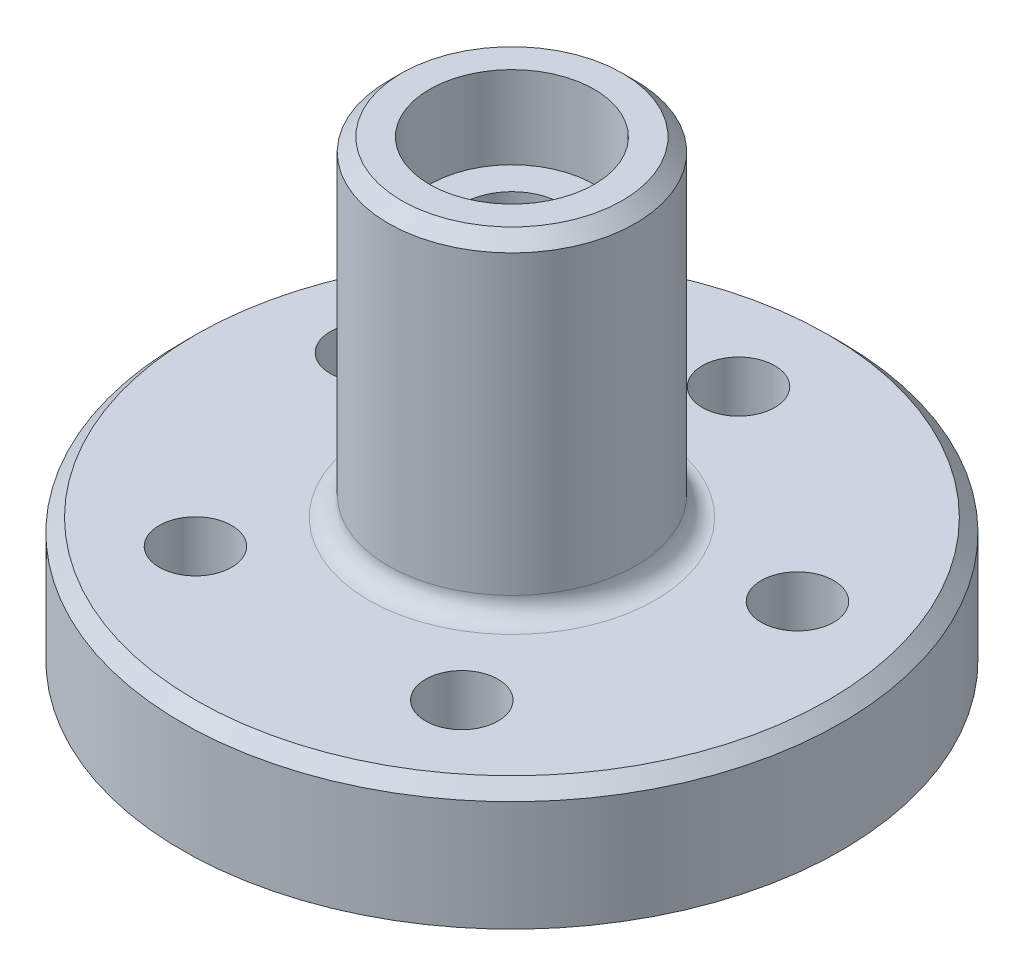
ISO-10303-21;
HEADER;
FILE_DESCRIPTION(('STEP AP214'),'2;1');
FILE_NAME('part.step','',(''),(''),'','','');
FILE_SCHEMA(('AUTOMOTIVE_DESIGN { 1 0 10303 214 1 1 1 1 }'));
ENDSEC;
DATA;
#1=APPLICATION_CONTEXT('core data for automotive mechanical design processes');
#2=APPLICATION_PROTOCOL_DEFINITION('international standard','automotive_design',2000,#1);
#3=PRODUCT_CONTEXT('',#1,'mechanical');
#4=PRODUCT('Part','Part','',(#3));
#5=PRODUCT_RELATED_PRODUCT_CATEGORY('part','',(#4));
#6=PRODUCT_DEFINITION_FORMATION('','',#4);
#7=PRODUCT_DEFINITION_CONTEXT('part definition',#1,'design');
#8=PRODUCT_DEFINITION('design','',#6,#7);
#9=PRODUCT_DEFINITION_SHAPE('','',#8);
#10=(LENGTH_UNIT() NAMED_UNIT(*) SI_UNIT(.MILLI.,.METRE.));
#11=(NAMED_UNIT(*) PLANE_ANGLE_UNIT() SI_UNIT($,.RADIAN.));
#12=(NAMED_UNIT(*) SI_UNIT($,.STERADIAN.) SOLID_ANGLE_UNIT());
#13=UNCERTAINTY_MEASURE_WITH_UNIT(LENGTH_MEASURE(1.E-05),#10,'distance_accuracy_value','');
#14=(GEOMETRIC_REPRESENTATION_CONTEXT(3) GLOBAL_UNCERTAINTY_ASSIGNED_CONTEXT((#13)) GLOBAL_UNIT_ASSIGNED_CONTEXT((#10,
#11,#12)) REPRESENTATION_CONTEXT('',''));
#15=CARTESIAN_POINT('',(0.,0.,0.));
#16=DIRECTION('',(0.,0.,1.));
#17=DIRECTION('',(1.,0.,0.));
#18=AXIS2_PLACEMENT_3D('',#15,#16,#17);
#19=CARTESIAN_POINT('',(0.,19.05,0.));
#20=DIRECTION('',(0.,-1.,0.));
#21=DIRECTION('',(0.,0.,-1.));
#22=AXIS2_PLACEMENT_3D('',#19,#20,#21);
#23=CYLINDRICAL_SURFACE('',#22,50.8);
#24=CARTESIAN_POINT('',(0.,17.0180000000001,0.));
#25=DIRECTION('',(0.,1.,0.));
#26=DIRECTION('',(0.,0.,1.));
#27=AXIS2_PLACEMENT_3D('',#24,#25,#26);
#28=CIRCLE('',#27,50.8);
#29=CARTESIAN_POINT('',(0.,17.0180000000001,-50.8));
#30=VERTEX_POINT('',#29);
#31=EDGE_CURVE('E64',#30,#30,#28,.F.);
#32=CARTESIAN_POINT('',(0.,0.,0.));
#33=DIRECTION('',(0.,1.,0.));
#34=DIRECTION('',(0.,0.,1.));
#35=AXIS2_PLACEMENT_3D('',#32,#33,#34);
#36=CIRCLE('',#35,50.8);
#37=CARTESIAN_POINT('',(0.,0.,-50.8));
#38=VERTEX_POINT('',#37);
#39=EDGE_CURVE('E72',#38,#38,#36,.T.);
#40=CARTESIAN_POINT('',(0.,17.0180000000001,-50.8));
#41=CARTESIAN_POINT('',(0.,16.8407291666668,-50.8));
#42=CARTESIAN_POINT('',(0.,16.6634583333334,-50.8));
#43=CARTESIAN_POINT('',(0.,16.3089166666668,-50.8));
#44=CARTESIAN_POINT('',(0.,16.1316458333334,-50.8));
#45=CARTESIAN_POINT('',(0.,15.7771041666668,-50.8));
#46=CARTESIAN_POINT('',(0.,15.5998333333334,-50.8));
#47=CARTESIAN_POINT('',(0.,15.2452916666668,-50.8));
#48=CARTESIAN_POINT('',(0.,15.0680208333334,-50.8));
#49=CARTESIAN_POINT('',(0.,14.7134791666668,-50.8));
#50=CARTESIAN_POINT('',(0.,14.5362083333334,-50.8));
#51=CARTESIAN_POINT('',(0.,14.1816666666668,-50.8));
#52=CARTESIAN_POINT('',(0.,14.0043958333334,-50.8));
#53=CARTESIAN_POINT('',(0.,13.6498541666668,-50.8));
#54=CARTESIAN_POINT('',(0.,13.4725833333334,-50.8));
#55=CARTESIAN_POINT('',(0.,13.1180416666667,-50.8));
#56=CARTESIAN_POINT('',(0.,12.9407708333334,-50.8));
#57=CARTESIAN_POINT('',(0.,12.5862291666667,-50.8));
#58=CARTESIAN_POINT('',(0.,12.4089583333334,-50.8));
#59=CARTESIAN_POINT('',(0.,12.0544166666667,-50.8));
#60=CARTESIAN_POINT('',(0.,11.8771458333334,-50.8));
#61=CARTESIAN_POINT('',(0.,11.5226041666667,-50.8));
#62=CARTESIAN_POINT('',(0.,11.3453333333334,-50.8));
#63=CARTESIAN_POINT('',(0.,10.9907916666667,-50.8));
#64=CARTESIAN_POINT('',(0.,10.8135208333334,-50.8));
#65=CARTESIAN_POINT('',(0.,10.4589791666667,-50.8));
#66=CARTESIAN_POINT('',(0.,10.2817083333334,-50.8));
#67=CARTESIAN_POINT('',(0.,9.92716666666673,-50.8));
#68=CARTESIAN_POINT('',(0.,9.74989583333339,-50.8));
#69=CARTESIAN_POINT('',(0.,9.39535416666672,-50.8));
#70=CARTESIAN_POINT('',(0.,9.21808333333339,-50.8));
#71=CARTESIAN_POINT('',(0.,8.86354166666672,-50.8));
#72=CARTESIAN_POINT('',(0.,8.68627083333339,-50.8));
#73=CARTESIAN_POINT('',(0.,8.33172916666672,-50.8));
#74=CARTESIAN_POINT('',(0.,8.15445833333338,-50.8));
#75=CARTESIAN_POINT('',(0.,7.79991666666671,-50.8));
#76=CARTESIAN_POINT('',(0.,7.62264583333338,-50.8));
#77=CARTESIAN_POINT('',(0.,7.26810416666671,-50.8));
#78=CARTESIAN_POINT('',(0.,7.09083333333338,-50.8));
#79=CARTESIAN_POINT('',(0.,6.73629166666671,-50.8));
#80=CARTESIAN_POINT('',(0.,6.55902083333337,-50.8));
#81=CARTESIAN_POINT('',(0.,6.2044791666667,-50.8));
#82=CARTESIAN_POINT('',(0.,6.02720833333337,-50.8));
#83=CARTESIAN_POINT('',(0.,5.6726666666667,-50.8));
#84=CARTESIAN_POINT('',(0.,5.49539583333337,-50.8));
#85=CARTESIAN_POINT('',(0.,5.1408541666667,-50.8));
#86=CARTESIAN_POINT('',(0.,4.96358333333336,-50.8));
#87=CARTESIAN_POINT('',(0.,4.60904166666669,-50.8));
#88=CARTESIAN_POINT('',(0.,4.43177083333336,-50.8));
#89=CARTESIAN_POINT('',(0.,4.07722916666669,-50.8));
#90=CARTESIAN_POINT('',(0.,3.89995833333336,-50.8));
#91=CARTESIAN_POINT('',(0.,3.54541666666669,-50.8));
#92=CARTESIAN_POINT('',(0.,3.36814583333335,-50.8));
#93=CARTESIAN_POINT('',(0.,3.01360416666668,-50.8));
#94=CARTESIAN_POINT('',(0.,2.83633333333335,-50.8));
#95=CARTESIAN_POINT('',(0.,2.48179166666668,-50.8));
#96=CARTESIAN_POINT('',(0.,2.30452083333335,-50.8));
#97=CARTESIAN_POINT('',(0.,1.94997916666668,-50.8));
#98=CARTESIAN_POINT('',(0.,1.77270833333334,-50.8));
#99=CARTESIAN_POINT('',(0.,1.41816666666667,-50.8));
#100=CARTESIAN_POINT('',(0.,1.24089583333334,-50.8));
#101=CARTESIAN_POINT('',(0.,0.88635416666667,-50.8));
#102=CARTESIAN_POINT('',(0.,0.709083333333335,-50.8));
#103=CARTESIAN_POINT('',(0.,0.354541666666666,-50.8));
#104=CARTESIAN_POINT('',(0.,0.177270833333333,-50.8));
#105=CARTESIAN_POINT('',(0.,0.,-50.8));
#106=B_SPLINE_CURVE_WITH_KNOTS('',3,(#40,#41,#42,#43,#44,#45,#46,#47,#48,#49,#50,#51,#52,#53,
#54,#55,#56,#57,#58,#59,#60,#61,#62,#63,#64,#65,#66,#67,#68,#69,#70,#71,#72,#73,#74,#75,#76,#77,
#78,#79,#80,#81,#82,#83,#84,#85,#86,#87,#88,#89,#90,#91,#92,#93,#94,#95,#96,#97,#98,#99,#100,
#101,#102,#103,#104,#105),.UNSPECIFIED.,.F.,.F.,(4,2,2,2,2,2,2,2,2,2,2,2,2,2,2,2,2,2,2,2,2,2,2,
2,2,2,2,2,2,2,2,2,4),(0.,0.531812500000006,1.06362500000001,1.59543750000001,2.12725000000001,
2.65906250000002,3.19087500000002,3.72268750000002,4.25450000000003,4.78631250000003,
5.31812500000003,5.84993750000004,6.38175000000004,6.91356250000004,7.44537500000005,
7.97718750000005,8.50900000000006,9.04081250000006,9.57262500000006,10.1044375000001,
10.6362500000001,11.1680625000001,11.6998750000001,12.2316875000001,12.7635000000001,
13.2953125000001,13.8271250000001,14.3589375000001,14.8907500000001,15.4225625000001,
15.9543750000001,16.4861875000001,17.0180000000001),.UNSPECIFIED.);
#107=EDGE_CURVE('BSEAM39',#30,#38,#106,.T.);
#108=ORIENTED_EDGE('',*,*,#31,.T.);
#109=ORIENTED_EDGE('',*,*,#39,.T.);
#110=ORIENTED_EDGE('',*,*,#107,.T.);
#111=ORIENTED_EDGE('',*,*,#107,.F.);
#112=EDGE_LOOP('',(#108,#110,#109,#111));
#113=FACE_BOUND('',#112,.T.);
#114=ADVANCED_FACE('F39',(#113),#23,.T.);
#115=CARTESIAN_POINT('',(0.,19.05,0.));
#116=DIRECTION('',(0.,1.,0.));
#117=DIRECTION('',(0.,0.,1.));
#118=AXIS2_PLACEMENT_3D('',#115,#116,#117);
#119=PLANE('',#118);
#120=CARTESIAN_POINT('',(0.,19.05,0.));
#121=DIRECTION('',(0.,1.,0.));
#122=DIRECTION('',(0.,0.,1.));
#123=AXIS2_PLACEMENT_3D('',#120,#121,#122);
#124=CIRCLE('',#123,22.098);
#125=CARTESIAN_POINT('',(0.,19.05,22.098));
#126=VERTEX_POINT('',#125);
#127=EDGE_CURVE('E53',#126,#126,#124,.F.);
#128=ORIENTED_EDGE('',*,*,#127,.T.);
#129=EDGE_LOOP('',(#128));
#130=FACE_BOUND('',#129,.T.);
#131=CARTESIAN_POINT('',(0.,19.05,-34.925));
#132=DIRECTION('',(0.,1.,0.));
#133=DIRECTION('',(0.,0.,1.));
#134=AXIS2_PLACEMENT_3D('',#131,#132,#133);
#135=CIRCLE('',#134,5.588);
#136=CARTESIAN_POINT('',(0.,19.05,-29.337));
#137=VERTEX_POINT('',#136);
#138=EDGE_CURVE('E110',#137,#137,#135,.T.);
#139=ORIENTED_EDGE('',*,*,#138,.F.);
#140=EDGE_LOOP('',(#139));
#141=FACE_BOUND('',#140,.T.);
#142=CARTESIAN_POINT('',(33.2156488316083,19.05,-10.7924185285449));
#143=DIRECTION('',(0.,1.,0.));
#144=DIRECTION('',(0.,0.,1.));
#145=AXIS2_PLACEMENT_3D('',#142,#143,#144);
#146=CIRCLE('',#145,5.588);
#147=CARTESIAN_POINT('',(33.2156488316083,19.05,-5.20441852854495));
#148=VERTEX_POINT('',#147);
#149=EDGE_CURVE('E102',#148,#148,#146,.T.);
#150=ORIENTED_EDGE('',*,*,#149,.F.);
#151=EDGE_LOOP('',(#150));
#152=FACE_BOUND('',#151,.T.);
#153=CARTESIAN_POINT('',(20.5283999363145,19.05,28.2549185285452));
#154=DIRECTION('',(0.,1.,0.));
#155=DIRECTION('',(0.,0.,1.));
#156=AXIS2_PLACEMENT_3D('',#153,#154,#155);
#157=CIRCLE('',#156,5.588);
#158=CARTESIAN_POINT('',(20.5283999363145,19.05,33.8429185285452));
#159=VERTEX_POINT('',#158);
#160=EDGE_CURVE('E94',#159,#159,#157,.T.);
#161=ORIENTED_EDGE('',*,*,#160,.F.);
#162=EDGE_LOOP('',(#161));
#163=FACE_BOUND('',#162,.T.);
#164=CARTESIAN_POINT('',(-20.5283999363149,19.05,28.2549185285449));
#165=DIRECTION('',(0.,1.,0.));
#166=DIRECTION('',(0.,0.,1.));
#167=AXIS2_PLACEMENT_3D('',#164,#165,#166);
#168=CIRCLE('',#167,5.588);
#169=CARTESIAN_POINT('',(-20.5283999363149,19.05,33.8429185285449));
#170=VERTEX_POINT('',#169);
#171=EDGE_CURVE('E86',#170,#170,#168,.T.);
#172=ORIENTED_EDGE('',*,*,#171,.F.);
#173=EDGE_LOOP('',(#172));
#174=FACE_BOUND('',#173,.T.);
#175=CARTESIAN_POINT('',(-33.2156488316081,19.05,-10.7924185285454));
#176=DIRECTION('',(0.,1.,0.));
#177=DIRECTION('',(0.,0.,1.));
#178=AXIS2_PLACEMENT_3D('',#175,#176,#177);
#179=CIRCLE('',#178,5.588);
#180=CARTESIAN_POINT('',(-33.2156488316081,19.05,-5.20441852854542));
#181=VERTEX_POINT('',#180);
#182=EDGE_CURVE('E77',#181,#181,#179,.T.);
#183=ORIENTED_EDGE('',*,*,#182,.F.);
#184=EDGE_LOOP('',(#183));
#185=FACE_BOUND('',#184,.T.);
#186=CARTESIAN_POINT('',(0.,19.05,0.));
#187=DIRECTION('',(0.,1.,0.));
#188=DIRECTION('',(0.,0.,1.));
#189=AXIS2_PLACEMENT_3D('',#186,#187,#188);
#190=CIRCLE('',#189,48.7680000000001);
#191=CARTESIAN_POINT('',(0.,19.05,48.7680000000001));
#192=VERTEX_POINT('',#191);
#193=EDGE_CURVE('E68',#192,#192,#190,.T.);
#194=ORIENTED_EDGE('',*,*,#193,.T.);
#195=EDGE_LOOP('',(#194));
#196=FACE_BOUND('',#195,.T.);
#197=ADVANCED_FACE('F167',(#130,#141,#152,#163,#174,#185,#196),#119,.T.);
#198=CARTESIAN_POINT('',(0.,0.,0.));
#199=DIRECTION('',(0.,1.,0.));
#200=DIRECTION('',(0.,0.,1.));
#201=AXIS2_PLACEMENT_3D('',#198,#199,#200);
#202=PLANE('',#201);
#203=CARTESIAN_POINT('',(0.,0.,0.));
#204=DIRECTION('',(0.,1.,0.));
#205=DIRECTION('',(0.,0.,1.));
#206=AXIS2_PLACEMENT_3D('',#203,#204,#205);
#207=CIRCLE('',#206,7.62);
#208=CARTESIAN_POINT('',(0.,0.,7.62));
#209=VERTEX_POINT('',#208);
#210=EDGE_CURVE('E121',#209,#209,#207,.T.);
#211=ORIENTED_EDGE('',*,*,#210,.T.);
#212=EDGE_LOOP('',(#211));
#213=FACE_BOUND('',#212,.T.);
#214=CARTESIAN_POINT('',(0.,0.,-34.925));
#215=DIRECTION('',(0.,1.,0.));
#216=DIRECTION('',(0.,0.,1.));
#217=AXIS2_PLACEMENT_3D('',#214,#215,#216);
#218=CIRCLE('',#217,5.588);
#219=CARTESIAN_POINT('',(0.,0.,-29.337));
#220=VERTEX_POINT('',#219);
#221=EDGE_CURVE('E76',#220,#220,#218,.T.);
#222=ORIENTED_EDGE('',*,*,#221,.T.);
#223=EDGE_LOOP('',(#222));
#224=FACE_BOUND('',#223,.T.);
#225=CARTESIAN_POINT('',(33.2156488316083,0.,-10.7924185285449));
#226=DIRECTION('',(0.,1.,0.));
#227=DIRECTION('',(0.,0.,1.));
#228=AXIS2_PLACEMENT_3D('',#225,#226,#227);
#229=CIRCLE('',#228,5.588);
#230=CARTESIAN_POINT('',(33.2156488316083,0.,-5.20441852854495));
#231=VERTEX_POINT('',#230);
#232=EDGE_CURVE('E106',#231,#231,#229,.T.);
#233=ORIENTED_EDGE('',*,*,#232,.T.);
#234=EDGE_LOOP('',(#233));
#235=FACE_BOUND('',#234,.T.);
#236=CARTESIAN_POINT('',(20.5283999363145,0.,28.2549185285452));
#237=DIRECTION('',(0.,1.,0.));
#238=DIRECTION('',(0.,0.,1.));
#239=AXIS2_PLACEMENT_3D('',#236,#237,#238);
#240=CIRCLE('',#239,5.588);
#241=CARTESIAN_POINT('',(20.5283999363145,0.,33.8429185285452));
#242=VERTEX_POINT('',#241);
#243=EDGE_CURVE('E98',#242,#242,#240,.T.);
#244=ORIENTED_EDGE('',*,*,#243,.T.);
#245=EDGE_LOOP('',(#244));
#246=FACE_BOUND('',#245,.T.);
#247=CARTESIAN_POINT('',(-20.5283999363149,0.,28.2549185285449));
#248=DIRECTION('',(0.,1.,0.));
#249=DIRECTION('',(0.,0.,1.));
#250=AXIS2_PLACEMENT_3D('',#247,#248,#249);
#251=CIRCLE('',#250,5.588);
#252=CARTESIAN_POINT('',(-20.5283999363149,0.,33.8429185285449));
#253=VERTEX_POINT('',#252);
#254=EDGE_CURVE('E90',#253,#253,#251,.T.);
#255=ORIENTED_EDGE('',*,*,#254,.T.);
#256=EDGE_LOOP('',(#255));
#257=FACE_BOUND('',#256,.T.);
#258=CARTESIAN_POINT('',(-33.2156488316081,0.,-10.7924185285454));
#259=DIRECTION('',(0.,1.,0.));
#260=DIRECTION('',(0.,0.,1.));
#261=AXIS2_PLACEMENT_3D('',#258,#259,#260);
#262=CIRCLE('',#261,5.588);
#263=CARTESIAN_POINT('',(-33.2156488316081,0.,-5.20441852854542));
#264=VERTEX_POINT('',#263);
#265=EDGE_CURVE('E81',#264,#264,#262,.T.);
#266=ORIENTED_EDGE('',*,*,#265,.T.);
#267=EDGE_LOOP('',(#266));
#268=FACE_BOUND('',#267,.T.);
#269=ORIENTED_EDGE('',*,*,#39,.F.);
#270=EDGE_LOOP('',(#269));
#271=FACE_BOUND('',#270,.T.);
#272=ADVANCED_FACE('F133',(#213,#224,#235,#246,#257,#268,#271),#202,.F.);
#273=CARTESIAN_POINT('',(0.,19.05,0.));
#274=DIRECTION('',(0.,-1.,0.));
#275=DIRECTION('',(0.,0.,-1.));
#276=AXIS2_PLACEMENT_3D('',#273,#274,#275);
#277=CONICAL_SURFACE('',#276,48.7680000000001,0.785398163397453);
#278=ORIENTED_EDGE('',*,*,#31,.F.);
#279=EDGE_LOOP('',(#278));
#280=FACE_BOUND('',#279,.T.);
#281=ORIENTED_EDGE('',*,*,#193,.F.);
#282=EDGE_LOOP('',(#281));
#283=FACE_BOUND('',#282,.T.);
#284=ADVANCED_FACE('F179',(#280,#283),#277,.T.);
#285=CARTESIAN_POINT('',(-33.2156488316081,0.,-10.7924185285454));
#286=DIRECTION('',(0.,1.,0.));
#287=DIRECTION('',(0.,0.,1.));
#288=AXIS2_PLACEMENT_3D('',#285,#286,#287);
#289=CYLINDRICAL_SURFACE('',#288,5.588);
#290=CARTESIAN_POINT('',(-33.2156488316081,0.,-5.20441852854542));
#291=CARTESIAN_POINT('',(-33.2156488316081,0.1984375,-5.20441852854542));
#292=CARTESIAN_POINT('',(-33.2156488316081,0.396875,-5.20441852854542));
#293=CARTESIAN_POINT('',(-33.2156488316081,0.79375,-5.20441852854542));
#294=CARTESIAN_POINT('',(-33.2156488316081,0.9921875,-5.20441852854542));
#295=CARTESIAN_POINT('',(-33.2156488316081,1.3890625,-5.20441852854542));
#296=CARTESIAN_POINT('',(-33.2156488316081,1.5875,-5.20441852854542));
#297=CARTESIAN_POINT('',(-33.2156488316081,1.984375,-5.20441852854542));
#298=CARTESIAN_POINT('',(-33.2156488316081,2.1828125,-5.20441852854542));
#299=CARTESIAN_POINT('',(-33.2156488316081,2.5796875,-5.20441852854542));
#300=CARTESIAN_POINT('',(-33.2156488316081,2.778125,-5.20441852854542));
#301=CARTESIAN_POINT('',(-33.2156488316081,3.175,-5.20441852854542));
#302=CARTESIAN_POINT('',(-33.2156488316081,3.3734375,-5.20441852854542));
#303=CARTESIAN_POINT('',(-33.2156488316081,3.7703125,-5.20441852854542));
#304=CARTESIAN_POINT('',(-33.2156488316081,3.96875,-5.20441852854542));
#305=CARTESIAN_POINT('',(-33.2156488316081,4.365625,-5.20441852854542));
#306=CARTESIAN_POINT('',(-33.2156488316081,4.5640625,-5.20441852854542));
#307=CARTESIAN_POINT('',(-33.2156488316081,4.9609375,-5.20441852854542));
#308=CARTESIAN_POINT('',(-33.2156488316081,5.159375,-5.20441852854542));
#309=CARTESIAN_POINT('',(-33.2156488316081,5.55625,-5.20441852854542));
#310=CARTESIAN_POINT('',(-33.2156488316081,5.7546875,-5.20441852854542));
#311=CARTESIAN_POINT('',(-33.2156488316081,6.1515625,-5.20441852854542));
#312=CARTESIAN_POINT('',(-33.2156488316081,6.35,-5.20441852854542));
#313=CARTESIAN_POINT('',(-33.2156488316081,6.746875,-5.20441852854542));
#314=CARTESIAN_POINT('',(-33.2156488316081,6.9453125,-5.20441852854542));
#315=CARTESIAN_POINT('',(-33.2156488316081,7.3421875,-5.20441852854542));
#316=CARTESIAN_POINT('',(-33.2156488316081,7.540625,-5.20441852854542));
#317=CARTESIAN_POINT('',(-33.2156488316081,7.9375,-5.20441852854542));
#318=CARTESIAN_POINT('',(-33.2156488316081,8.1359375,-5.20441852854542));
#319=CARTESIAN_POINT('',(-33.2156488316081,8.5328125,-5.20441852854542));
#320=CARTESIAN_POINT('',(-33.2156488316081,8.73125,-5.20441852854542));
#321=CARTESIAN_POINT('',(-33.2156488316081,9.128125,-5.20441852854542));
#322=CARTESIAN_POINT('',(-33.2156488316081,9.3265625,-5.20441852854542));
#323=CARTESIAN_POINT('',(-33.2156488316081,9.7234375,-5.20441852854542));
#324=CARTESIAN_POINT('',(-33.2156488316081,9.921875,-5.20441852854542));
#325=CARTESIAN_POINT('',(-33.2156488316081,10.31875,-5.20441852854542));
#326=CARTESIAN_POINT('',(-33.2156488316081,10.5171875,-5.20441852854542));
#327=CARTESIAN_POINT('',(-33.2156488316081,10.9140625,-5.20441852854542));
#328=CARTESIAN_POINT('',(-33.2156488316081,11.1125,-5.20441852854542));
#329=CARTESIAN_POINT('',(-33.2156488316081,11.509375,-5.20441852854542));
#330=CARTESIAN_POINT('',(-33.2156488316081,11.7078125,-5.20441852854542));
#331=CARTESIAN_POINT('',(-33.2156488316081,12.1046875,-5.20441852854542));
#332=CARTESIAN_POINT('',(-33.2156488316081,12.303125,-5.20441852854542));
#333=CARTESIAN_POINT('',(-33.2156488316081,12.7,-5.20441852854542));
#334=CARTESIAN_POINT('',(-33.2156488316081,12.8984375,-5.20441852854542));
#335=CARTESIAN_POINT('',(-33.2156488316081,13.2953125,-5.20441852854542));
#336=CARTESIAN_POINT('',(-33.2156488316081,13.49375,-5.20441852854542));
#337=CARTESIAN_POINT('',(-33.2156488316081,13.890625,-5.20441852854542));
#338=CARTESIAN_POINT('',(-33.2156488316081,14.0890625,-5.20441852854542));
#339=CARTESIAN_POINT('',(-33.2156488316081,14.4859375,-5.20441852854542));
#340=CARTESIAN_POINT('',(-33.2156488316081,14.684375,-5.20441852854542));
#341=CARTESIAN_POINT('',(-33.2156488316081,15.08125,-5.20441852854542));
#342=CARTESIAN_POINT('',(-33.2156488316081,15.2796875,-5.20441852854542));
#343=CARTESIAN_POINT('',(-33.2156488316081,15.6765625,-5.20441852854542));
#344=CARTESIAN_POINT('',(-33.2156488316081,15.875,-5.20441852854542));
#345=CARTESIAN_POINT('',(-33.2156488316081,16.271875,-5.20441852854542));
#346=CARTESIAN_POINT('',(-33.2156488316081,16.4703125,-5.20441852854542));
#347=CARTESIAN_POINT('',(-33.2156488316081,16.8671875,-5.20441852854542));
#348=CARTESIAN_POINT('',(-33.2156488316081,17.065625,-5.20441852854542));
#349=CARTESIAN_POINT('',(-33.2156488316081,17.4625,-5.20441852854542));
#350=CARTESIAN_POINT('',(-33.2156488316081,17.6609375,-5.20441852854542));
#351=CARTESIAN_POINT('',(-33.2156488316081,18.0578125,-5.20441852854542));
#352=CARTESIAN_POINT('',(-33.2156488316081,18.25625,-5.20441852854542));
#353=CARTESIAN_POINT('',(-33.2156488316081,18.653125,-5.20441852854542));
#354=CARTESIAN_POINT('',(-33.2156488316081,18.8515625,-5.20441852854542));
#355=CARTESIAN_POINT('',(-33.2156488316081,19.05,-5.20441852854542));
#356=B_SPLINE_CURVE_WITH_KNOTS('',3,(#290,#291,#292,#293,#294,#295,#296,#297,#298,#299,#300,
#301,#302,#303,#304,#305,#306,#307,#308,#309,#310,#311,#312,#313,#314,#315,#316,#317,#318,#319,
#320,#321,#322,#323,#324,#325,#326,#327,#328,#329,#330,#331,#332,#333,#334,#335,#336,#337,#338,
#339,#340,#341,#342,#343,#344,#345,#346,#347,#348,#349,#350,#351,#352,#353,#354,#355),
.UNSPECIFIED.,.F.,.F.,(4,2,2,2,2,2,2,2,2,2,2,2,2,2,2,2,2,2,2,2,2,2,2,2,2,2,2,2,2,2,2,2,4),(0.,
0.5953125,1.190625,1.7859375,2.38125,2.9765625,3.571875,4.1671875,4.7625,5.3578125,5.953125,
6.5484375,7.14375,7.7390625,8.334375,8.9296875,9.525,10.1203125,10.715625,11.3109375,11.90625,
12.5015625,13.096875,13.6921875,14.2875,14.8828125,15.478125,16.0734375,16.66875,17.2640625,
17.859375,18.4546875,19.05),.UNSPECIFIED.);
#357=EDGE_CURVE('BSEAM183',#264,#181,#356,.T.);
#358=ORIENTED_EDGE('',*,*,#265,.F.);
#359=ORIENTED_EDGE('',*,*,#182,.T.);
#360=ORIENTED_EDGE('',*,*,#357,.T.);
#361=ORIENTED_EDGE('',*,*,#357,.F.);
#362=EDGE_LOOP('',(#358,#360,#359,#361));
#363=FACE_BOUND('',#362,.T.);
#364=ADVANCED_FACE('F183',(#363),#289,.F.);
#365=CARTESIAN_POINT('',(-20.5283999363149,0.,28.2549185285449));
#366=DIRECTION('',(0.,1.,0.));
#367=DIRECTION('',(0.,0.,1.));
#368=AXIS2_PLACEMENT_3D('',#365,#366,#367);
#369=CYLINDRICAL_SURFACE('',#368,5.588);
#370=CARTESIAN_POINT('',(-20.5283999363149,0.,33.8429185285449));
#371=CARTESIAN_POINT('',(-20.5283999363149,0.1984375,33.8429185285449));
#372=CARTESIAN_POINT('',(-20.5283999363149,0.396875,33.8429185285449));
#373=CARTESIAN_POINT('',(-20.5283999363149,0.79375,33.8429185285449));
#374=CARTESIAN_POINT('',(-20.5283999363149,0.9921875,33.8429185285449));
#375=CARTESIAN_POINT('',(-20.5283999363149,1.3890625,33.8429185285449));
#376=CARTESIAN_POINT('',(-20.5283999363149,1.5875,33.8429185285449));
#377=CARTESIAN_POINT('',(-20.5283999363149,1.984375,33.8429185285449));
#378=CARTESIAN_POINT('',(-20.5283999363149,2.1828125,33.8429185285449));
#379=CARTESIAN_POINT('',(-20.5283999363149,2.5796875,33.8429185285449));
#380=CARTESIAN_POINT('',(-20.5283999363149,2.778125,33.8429185285449));
#381=CARTESIAN_POINT('',(-20.5283999363149,3.175,33.8429185285449));
#382=CARTESIAN_POINT('',(-20.5283999363149,3.3734375,33.8429185285449));
#383=CARTESIAN_POINT('',(-20.5283999363149,3.7703125,33.8429185285449));
#384=CARTESIAN_POINT('',(-20.5283999363149,3.96875,33.8429185285449));
#385=CARTESIAN_POINT('',(-20.5283999363149,4.365625,33.8429185285449));
#386=CARTESIAN_POINT('',(-20.5283999363149,4.5640625,33.8429185285449));
#387=CARTESIAN_POINT('',(-20.5283999363149,4.9609375,33.8429185285449));
#388=CARTESIAN_POINT('',(-20.5283999363149,5.159375,33.8429185285449));
#389=CARTESIAN_POINT('',(-20.5283999363149,5.55625,33.8429185285449));
#390=CARTESIAN_POINT('',(-20.5283999363149,5.7546875,33.8429185285449));
#391=CARTESIAN_POINT('',(-20.5283999363149,6.1515625,33.8429185285449));
#392=CARTESIAN_POINT('',(-20.5283999363149,6.35,33.8429185285449));
#393=CARTESIAN_POINT('',(-20.5283999363149,6.746875,33.8429185285449));
#394=CARTESIAN_POINT('',(-20.5283999363149,6.9453125,33.8429185285449));
#395=CARTESIAN_POINT('',(-20.5283999363149,7.3421875,33.8429185285449));
#396=CARTESIAN_POINT('',(-20.5283999363149,7.540625,33.8429185285449));
#397=CARTESIAN_POINT('',(-20.5283999363149,7.9375,33.8429185285449));
#398=CARTESIAN_POINT('',(-20.5283999363149,8.1359375,33.8429185285449));
#399=CARTESIAN_POINT('',(-20.5283999363149,8.5328125,33.8429185285449));
#400=CARTESIAN_POINT('',(-20.5283999363149,8.73125,33.8429185285449));
#401=CARTESIAN_POINT('',(-20.5283999363149,9.128125,33.8429185285449));
#402=CARTESIAN_POINT('',(-20.5283999363149,9.3265625,33.8429185285449));
#403=CARTESIAN_POINT('',(-20.5283999363149,9.7234375,33.8429185285449));
#404=CARTESIAN_POINT('',(-20.5283999363149,9.921875,33.8429185285449));
#405=CARTESIAN_POINT('',(-20.5283999363149,10.31875,33.8429185285449));
#406=CARTESIAN_POINT('',(-20.5283999363149,10.5171875,33.8429185285449));
#407=CARTESIAN_POINT('',(-20.5283999363149,10.9140625,33.8429185285449));
#408=CARTESIAN_POINT('',(-20.5283999363149,11.1125,33.8429185285449));
#409=CARTESIAN_POINT('',(-20.5283999363149,11.509375,33.8429185285449));
#410=CARTESIAN_POINT('',(-20.5283999363149,11.7078125,33.8429185285449));
#411=CARTESIAN_POINT('',(-20.5283999363149,12.1046875,33.8429185285449));
#412=CARTESIAN_POINT('',(-20.5283999363149,12.303125,33.8429185285449));
#413=CARTESIAN_POINT('',(-20.5283999363149,12.7,33.8429185285449));
#414=CARTESIAN_POINT('',(-20.5283999363149,12.8984375,33.8429185285449));
#415=CARTESIAN_POINT('',(-20.5283999363149,13.2953125,33.8429185285449));
#416=CARTESIAN_POINT('',(-20.5283999363149,13.49375,33.8429185285449));
#417=CARTESIAN_POINT('',(-20.5283999363149,13.890625,33.8429185285449));
#418=CARTESIAN_POINT('',(-20.5283999363149,14.0890625,33.8429185285449));
#419=CARTESIAN_POINT('',(-20.5283999363149,14.4859375,33.8429185285449));
#420=CARTESIAN_POINT('',(-20.5283999363149,14.684375,33.8429185285449));
#421=CARTESIAN_POINT('',(-20.5283999363149,15.08125,33.8429185285449));
#422=CARTESIAN_POINT('',(-20.5283999363149,15.2796875,33.8429185285449));
#423=CARTESIAN_POINT('',(-20.5283999363149,15.6765625,33.8429185285449));
#424=CARTESIAN_POINT('',(-20.5283999363149,15.875,33.8429185285449));
#425=CARTESIAN_POINT('',(-20.5283999363149,16.271875,33.8429185285449));
#426=CARTESIAN_POINT('',(-20.5283999363149,16.4703125,33.8429185285449));
#427=CARTESIAN_POINT('',(-20.5283999363149,16.8671875,33.8429185285449));
#428=CARTESIAN_POINT('',(-20.5283999363149,17.065625,33.8429185285449));
#429=CARTESIAN_POINT('',(-20.5283999363149,17.4625,33.8429185285449));
#430=CARTESIAN_POINT('',(-20.5283999363149,17.6609375,33.8429185285449));
#431=CARTESIAN_POINT('',(-20.5283999363149,18.0578125,33.8429185285449));
#432=CARTESIAN_POINT('',(-20.5283999363149,18.25625,33.8429185285449));
#433=CARTESIAN_POINT('',(-20.5283999363149,18.653125,33.8429185285449));
#434=CARTESIAN_POINT('',(-20.5283999363149,18.8515625,33.8429185285449));
#435=CARTESIAN_POINT('',(-20.5283999363149,19.05,33.8429185285449));
#436=B_SPLINE_CURVE_WITH_KNOTS('',3,(#370,#371,#372,#373,#374,#375,#376,#377,#378,#379,#380,
#381,#382,#383,#384,#385,#386,#387,#388,#389,#390,#391,#392,#393,#394,#395,#396,#397,#398,#399,
#400,#401,#402,#403,#404,#405,#406,#407,#408,#409,#410,#411,#412,#413,#414,#415,#416,#417,#418,
#419,#420,#421,#422,#423,#424,#425,#426,#427,#428,#429,#430,#431,#432,#433,#434,#435),
.UNSPECIFIED.,.F.,.F.,(4,2,2,2,2,2,2,2,2,2,2,2,2,2,2,2,2,2,2,2,2,2,2,2,2,2,2,2,2,2,2,2,4),(0.,
0.5953125,1.190625,1.7859375,2.38125,2.9765625,3.571875,4.1671875,4.7625,5.3578125,5.953125,
6.5484375,7.14375,7.7390625,8.334375,8.9296875,9.525,10.1203125,10.715625,11.3109375,11.90625,
12.5015625,13.096875,13.6921875,14.2875,14.8828125,15.478125,16.0734375,16.66875,17.2640625,
17.859375,18.4546875,19.05),.UNSPECIFIED.);
#437=EDGE_CURVE('BSEAM189',#253,#170,#436,.T.);
#438=ORIENTED_EDGE('',*,*,#254,.F.);
#439=ORIENTED_EDGE('',*,*,#171,.T.);
#440=ORIENTED_EDGE('',*,*,#437,.T.);
#441=ORIENTED_EDGE('',*,*,#437,.F.);
#442=EDGE_LOOP('',(#438,#440,#439,#441));
#443=FACE_BOUND('',#442,.T.);
#444=ADVANCED_FACE('F189',(#443),#369,.F.);
#445=CARTESIAN_POINT('',(20.5283999363145,0.,28.2549185285452));
#446=DIRECTION('',(0.,1.,0.));
#447=DIRECTION('',(0.,0.,1.));
#448=AXIS2_PLACEMENT_3D('',#445,#446,#447);
#449=CYLINDRICAL_SURFACE('',#448,5.588);
#450=CARTESIAN_POINT('',(20.5283999363145,0.,33.8429185285452));
#451=CARTESIAN_POINT('',(20.5283999363145,0.1984375,33.8429185285452));
#452=CARTESIAN_POINT('',(20.5283999363145,0.396875,33.8429185285452));
#453=CARTESIAN_POINT('',(20.5283999363145,0.79375,33.8429185285452));
#454=CARTESIAN_POINT('',(20.5283999363145,0.9921875,33.8429185285452));
#455=CARTESIAN_POINT('',(20.5283999363145,1.3890625,33.8429185285452));
#456=CARTESIAN_POINT('',(20.5283999363145,1.5875,33.8429185285452));
#457=CARTESIAN_POINT('',(20.5283999363145,1.984375,33.8429185285452));
#458=CARTESIAN_POINT('',(20.5283999363145,2.1828125,33.8429185285452));
#459=CARTESIAN_POINT('',(20.5283999363145,2.5796875,33.8429185285452));
#460=CARTESIAN_POINT('',(20.5283999363145,2.778125,33.8429185285452));
#461=CARTESIAN_POINT('',(20.5283999363145,3.175,33.8429185285452));
#462=CARTESIAN_POINT('',(20.5283999363145,3.3734375,33.8429185285452));
#463=CARTESIAN_POINT('',(20.5283999363145,3.7703125,33.8429185285452));
#464=CARTESIAN_POINT('',(20.5283999363145,3.96875,33.8429185285452));
#465=CARTESIAN_POINT('',(20.5283999363145,4.365625,33.8429185285452));
#466=CARTESIAN_POINT('',(20.5283999363145,4.5640625,33.8429185285452));
#467=CARTESIAN_POINT('',(20.5283999363145,4.9609375,33.8429185285452));
#468=CARTESIAN_POINT('',(20.5283999363145,5.159375,33.8429185285452));
#469=CARTESIAN_POINT('',(20.5283999363145,5.55625,33.8429185285452));
#470=CARTESIAN_POINT('',(20.5283999363145,5.7546875,33.8429185285452));
#471=CARTESIAN_POINT('',(20.5283999363145,6.1515625,33.8429185285452));
#472=CARTESIAN_POINT('',(20.5283999363145,6.35,33.8429185285452));
#473=CARTESIAN_POINT('',(20.5283999363145,6.746875,33.8429185285452));
#474=CARTESIAN_POINT('',(20.5283999363145,6.9453125,33.8429185285452));
#475=CARTESIAN_POINT('',(20.5283999363145,7.3421875,33.8429185285452));
#476=CARTESIAN_POINT('',(20.5283999363145,7.540625,33.8429185285452));
#477=CARTESIAN_POINT('',(20.5283999363145,7.9375,33.8429185285452));
#478=CARTESIAN_POINT('',(20.5283999363145,8.1359375,33.8429185285452));
#479=CARTESIAN_POINT('',(20.5283999363145,8.5328125,33.8429185285452));
#480=CARTESIAN_POINT('',(20.5283999363145,8.73125,33.8429185285452));
#481=CARTESIAN_POINT('',(20.5283999363145,9.128125,33.8429185285452));
#482=CARTESIAN_POINT('',(20.5283999363145,9.3265625,33.8429185285452));
#483=CARTESIAN_POINT('',(20.5283999363145,9.7234375,33.8429185285452));
#484=CARTESIAN_POINT('',(20.5283999363145,9.921875,33.8429185285452));
#485=CARTESIAN_POINT('',(20.5283999363145,10.31875,33.8429185285452));
#486=CARTESIAN_POINT('',(20.5283999363145,10.5171875,33.8429185285452));
#487=CARTESIAN_POINT('',(20.5283999363145,10.9140625,33.8429185285452));
#488=CARTESIAN_POINT('',(20.5283999363145,11.1125,33.8429185285452));
#489=CARTESIAN_POINT('',(20.5283999363145,11.509375,33.8429185285452));
#490=CARTESIAN_POINT('',(20.5283999363145,11.7078125,33.8429185285452));
#491=CARTESIAN_POINT('',(20.5283999363145,12.1046875,33.8429185285452));
#492=CARTESIAN_POINT('',(20.5283999363145,12.303125,33.8429185285452));
#493=CARTESIAN_POINT('',(20.5283999363145,12.7,33.8429185285452));
#494=CARTESIAN_POINT('',(20.5283999363145,12.8984375,33.8429185285452));
#495=CARTESIAN_POINT('',(20.5283999363145,13.2953125,33.8429185285452));
#496=CARTESIAN_POINT('',(20.5283999363145,13.49375,33.8429185285452));
#497=CARTESIAN_POINT('',(20.5283999363145,13.890625,33.8429185285452));
#498=CARTESIAN_POINT('',(20.5283999363145,14.0890625,33.8429185285452));
#499=CARTESIAN_POINT('',(20.5283999363145,14.4859375,33.8429185285452));
#500=CARTESIAN_POINT('',(20.5283999363145,14.684375,33.8429185285452));
#501=CARTESIAN_POINT('',(20.5283999363145,15.08125,33.8429185285452));
#502=CARTESIAN_POINT('',(20.5283999363145,15.2796875,33.8429185285452));
#503=CARTESIAN_POINT('',(20.5283999363145,15.6765625,33.8429185285452));
#504=CARTESIAN_POINT('',(20.5283999363145,15.875,33.8429185285452));
#505=CARTESIAN_POINT('',(20.5283999363145,16.271875,33.8429185285452));
#506=CARTESIAN_POINT('',(20.5283999363145,16.4703125,33.8429185285452));
#507=CARTESIAN_POINT('',(20.5283999363145,16.8671875,33.8429185285452));
#508=CARTESIAN_POINT('',(20.5283999363145,17.065625,33.8429185285452));
#509=CARTESIAN_POINT('',(20.5283999363145,17.4625,33.8429185285452));
#510=CARTESIAN_POINT('',(20.5283999363145,17.6609375,33.8429185285452));
#511=CARTESIAN_POINT('',(20.5283999363145,18.0578125,33.8429185285452));
#512=CARTESIAN_POINT('',(20.5283999363145,18.25625,33.8429185285452));
#513=CARTESIAN_POINT('',(20.5283999363145,18.653125,33.8429185285452));
#514=CARTESIAN_POINT('',(20.5283999363145,18.8515625,33.8429185285452));
#515=CARTESIAN_POINT('',(20.5283999363145,19.05,33.8429185285452));
#516=B_SPLINE_CURVE_WITH_KNOTS('',3,(#450,#451,#452,#453,#454,#455,#456,#457,#458,#459,#460,
#461,#462,#463,#464,#465,#466,#467,#468,#469,#470,#471,#472,#473,#474,#475,#476,#477,#478,#479,
#480,#481,#482,#483,#484,#485,#486,#487,#488,#489,#490,#491,#492,#493,#494,#495,#496,#497,#498,
#499,#500,#501,#502,#503,#504,#505,#506,#507,#508,#509,#510,#511,#512,#513,#514,#515),
.UNSPECIFIED.,.F.,.F.,(4,2,2,2,2,2,2,2,2,2,2,2,2,2,2,2,2,2,2,2,2,2,2,2,2,2,2,2,2,2,2,2,4),(0.,
0.5953125,1.190625,1.7859375,2.38125,2.9765625,3.571875,4.1671875,4.7625,5.3578125,5.953125,
6.5484375,7.14375,7.7390625,8.334375,8.9296875,9.525,10.1203125,10.715625,11.3109375,11.90625,
12.5015625,13.096875,13.6921875,14.2875,14.8828125,15.478125,16.0734375,16.66875,17.2640625,
17.859375,18.4546875,19.05),.UNSPECIFIED.);
#517=EDGE_CURVE('BSEAM262',#242,#159,#516,.T.);
#518=ORIENTED_EDGE('',*,*,#243,.F.);
#519=ORIENTED_EDGE('',*,*,#160,.T.);
#520=ORIENTED_EDGE('',*,*,#517,.T.);
#521=ORIENTED_EDGE('',*,*,#517,.F.);
#522=EDGE_LOOP('',(#518,#520,#519,#521));
#523=FACE_BOUND('',#522,.T.);
#524=ADVANCED_FACE('F262',(#523),#449,.F.);
#525=CARTESIAN_POINT('',(33.2156488316083,0.,-10.7924185285449));
#526=DIRECTION('',(0.,1.,0.));
#527=DIRECTION('',(0.,0.,1.));
#528=AXIS2_PLACEMENT_3D('',#525,#526,#527);
#529=CYLINDRICAL_SURFACE('',#528,5.588);
#530=CARTESIAN_POINT('',(33.2156488316083,0.,-5.20441852854495));
#531=CARTESIAN_POINT('',(33.2156488316083,0.1984375,-5.20441852854495));
#532=CARTESIAN_POINT('',(33.2156488316083,0.396875,-5.20441852854495));
#533=CARTESIAN_POINT('',(33.2156488316083,0.79375,-5.20441852854495));
#534=CARTESIAN_POINT('',(33.2156488316083,0.9921875,-5.20441852854495));
#535=CARTESIAN_POINT('',(33.2156488316083,1.3890625,-5.20441852854495));
#536=CARTESIAN_POINT('',(33.2156488316083,1.5875,-5.20441852854495));
#537=CARTESIAN_POINT('',(33.2156488316083,1.984375,-5.20441852854495));
#538=CARTESIAN_POINT('',(33.2156488316083,2.1828125,-5.20441852854495));
#539=CARTESIAN_POINT('',(33.2156488316083,2.5796875,-5.20441852854495));
#540=CARTESIAN_POINT('',(33.2156488316083,2.778125,-5.20441852854495));
#541=CARTESIAN_POINT('',(33.2156488316083,3.175,-5.20441852854495));
#542=CARTESIAN_POINT('',(33.2156488316083,3.3734375,-5.20441852854495));
#543=CARTESIAN_POINT('',(33.2156488316083,3.7703125,-5.20441852854495));
#544=CARTESIAN_POINT('',(33.2156488316083,3.96875,-5.20441852854495));
#545=CARTESIAN_POINT('',(33.2156488316083,4.365625,-5.20441852854495));
#546=CARTESIAN_POINT('',(33.2156488316083,4.5640625,-5.20441852854495));
#547=CARTESIAN_POINT('',(33.2156488316083,4.9609375,-5.20441852854495));
#548=CARTESIAN_POINT('',(33.2156488316083,5.159375,-5.20441852854495));
#549=CARTESIAN_POINT('',(33.2156488316083,5.55625,-5.20441852854495));
#550=CARTESIAN_POINT('',(33.2156488316083,5.7546875,-5.20441852854495));
#551=CARTESIAN_POINT('',(33.2156488316083,6.1515625,-5.20441852854495));
#552=CARTESIAN_POINT('',(33.2156488316083,6.35,-5.20441852854495));
#553=CARTESIAN_POINT('',(33.2156488316083,6.746875,-5.20441852854495));
#554=CARTESIAN_POINT('',(33.2156488316083,6.9453125,-5.20441852854495));
#555=CARTESIAN_POINT('',(33.2156488316083,7.3421875,-5.20441852854495));
#556=CARTESIAN_POINT('',(33.2156488316083,7.540625,-5.20441852854495));
#557=CARTESIAN_POINT('',(33.2156488316083,7.9375,-5.20441852854495));
#558=CARTESIAN_POINT('',(33.2156488316083,8.1359375,-5.20441852854495));
#559=CARTESIAN_POINT('',(33.2156488316083,8.5328125,-5.20441852854495));
#560=CARTESIAN_POINT('',(33.2156488316083,8.73125,-5.20441852854495));
#561=CARTESIAN_POINT('',(33.2156488316083,9.128125,-5.20441852854495));
#562=CARTESIAN_POINT('',(33.2156488316083,9.3265625,-5.20441852854495));
#563=CARTESIAN_POINT('',(33.2156488316083,9.7234375,-5.20441852854495));
#564=CARTESIAN_POINT('',(33.2156488316083,9.921875,-5.20441852854495));
#565=CARTESIAN_POINT('',(33.2156488316083,10.31875,-5.20441852854495));
#566=CARTESIAN_POINT('',(33.2156488316083,10.5171875,-5.20441852854495));
#567=CARTESIAN_POINT('',(33.2156488316083,10.9140625,-5.20441852854495));
#568=CARTESIAN_POINT('',(33.2156488316083,11.1125,-5.20441852854495));
#569=CARTESIAN_POINT('',(33.2156488316083,11.509375,-5.20441852854495));
#570=CARTESIAN_POINT('',(33.2156488316083,11.7078125,-5.20441852854495));
#571=CARTESIAN_POINT('',(33.2156488316083,12.1046875,-5.20441852854495));
#572=CARTESIAN_POINT('',(33.2156488316083,12.303125,-5.20441852854495));
#573=CARTESIAN_POINT('',(33.2156488316083,12.7,-5.20441852854495));
#574=CARTESIAN_POINT('',(33.2156488316083,12.8984375,-5.20441852854495));
#575=CARTESIAN_POINT('',(33.2156488316083,13.2953125,-5.20441852854495));
#576=CARTESIAN_POINT('',(33.2156488316083,13.49375,-5.20441852854495));
#577=CARTESIAN_POINT('',(33.2156488316083,13.890625,-5.20441852854495));
#578=CARTESIAN_POINT('',(33.2156488316083,14.0890625,-5.20441852854495));
#579=CARTESIAN_POINT('',(33.2156488316083,14.4859375,-5.20441852854495));
#580=CARTESIAN_POINT('',(33.2156488316083,14.684375,-5.20441852854495));
#581=CARTESIAN_POINT('',(33.2156488316083,15.08125,-5.20441852854495));
#582=CARTESIAN_POINT('',(33.2156488316083,15.2796875,-5.20441852854495));
#583=CARTESIAN_POINT('',(33.2156488316083,15.6765625,-5.20441852854495));
#584=CARTESIAN_POINT('',(33.2156488316083,15.875,-5.20441852854495));
#585=CARTESIAN_POINT('',(33.2156488316083,16.271875,-5.20441852854495));
#586=CARTESIAN_POINT('',(33.2156488316083,16.4703125,-5.20441852854495));
#587=CARTESIAN_POINT('',(33.2156488316083,16.8671875,-5.20441852854495));
#588=CARTESIAN_POINT('',(33.2156488316083,17.065625,-5.20441852854495));
#589=CARTESIAN_POINT('',(33.2156488316083,17.4625,-5.20441852854495));
#590=CARTESIAN_POINT('',(33.2156488316083,17.6609375,-5.20441852854495));
#591=CARTESIAN_POINT('',(33.2156488316083,18.0578125,-5.20441852854495));
#592=CARTESIAN_POINT('',(33.2156488316083,18.25625,-5.20441852854495));
#593=CARTESIAN_POINT('',(33.2156488316083,18.653125,-5.20441852854495));
#594=CARTESIAN_POINT('',(33.2156488316083,18.8515625,-5.20441852854495));
#595=CARTESIAN_POINT('',(33.2156488316083,19.05,-5.20441852854495));
#596=B_SPLINE_CURVE_WITH_KNOTS('',3,(#530,#531,#532,#533,#534,#535,#536,#537,#538,#539,#540,
#541,#542,#543,#544,#545,#546,#547,#548,#549,#550,#551,#552,#553,#554,#555,#556,#557,#558,#559,
#560,#561,#562,#563,#564,#565,#566,#567,#568,#569,#570,#571,#572,#573,#574,#575,#576,#577,#578,
#579,#580,#581,#582,#583,#584,#585,#586,#587,#588,#589,#590,#591,#592,#593,#594,#595),
.UNSPECIFIED.,.F.,.F.,(4,2,2,2,2,2,2,2,2,2,2,2,2,2,2,2,2,2,2,2,2,2,2,2,2,2,2,2,2,2,2,2,4),(0.,
0.5953125,1.190625,1.7859375,2.38125,2.9765625,3.571875,4.1671875,4.7625,5.3578125,5.953125,
6.5484375,7.14375,7.7390625,8.334375,8.9296875,9.525,10.1203125,10.715625,11.3109375,11.90625,
12.5015625,13.096875,13.6921875,14.2875,14.8828125,15.478125,16.0734375,16.66875,17.2640625,
17.859375,18.4546875,19.05),.UNSPECIFIED.);
#597=EDGE_CURVE('BSEAM257',#231,#148,#596,.T.);
#598=ORIENTED_EDGE('',*,*,#232,.F.);
#599=ORIENTED_EDGE('',*,*,#149,.T.);
#600=ORIENTED_EDGE('',*,*,#597,.T.);
#601=ORIENTED_EDGE('',*,*,#597,.F.);
#602=EDGE_LOOP('',(#598,#600,#599,#601));
#603=FACE_BOUND('',#602,.T.);
#604=ADVANCED_FACE('F257',(#603),#529,.F.);
#605=CARTESIAN_POINT('',(0.,0.,-34.925));
#606=DIRECTION('',(0.,1.,0.));
#607=DIRECTION('',(0.,0.,1.));
#608=AXIS2_PLACEMENT_3D('',#605,#606,#607);
#609=CYLINDRICAL_SURFACE('',#608,5.588);
#610=CARTESIAN_POINT('',(0.,0.,-29.337));
#611=CARTESIAN_POINT('',(0.,0.1984375,-29.337));
#612=CARTESIAN_POINT('',(0.,0.396875,-29.337));
#613=CARTESIAN_POINT('',(0.,0.79375,-29.337));
#614=CARTESIAN_POINT('',(0.,0.9921875,-29.337));
#615=CARTESIAN_POINT('',(0.,1.3890625,-29.337));
#616=CARTESIAN_POINT('',(0.,1.5875,-29.337));
#617=CARTESIAN_POINT('',(0.,1.984375,-29.337));
#618=CARTESIAN_POINT('',(0.,2.1828125,-29.337));
#619=CARTESIAN_POINT('',(0.,2.5796875,-29.337));
#620=CARTESIAN_POINT('',(0.,2.778125,-29.337));
#621=CARTESIAN_POINT('',(0.,3.175,-29.337));
#622=CARTESIAN_POINT('',(0.,3.3734375,-29.337));
#623=CARTESIAN_POINT('',(0.,3.7703125,-29.337));
#624=CARTESIAN_POINT('',(0.,3.96875,-29.337));
#625=CARTESIAN_POINT('',(0.,4.365625,-29.337));
#626=CARTESIAN_POINT('',(0.,4.5640625,-29.337));
#627=CARTESIAN_POINT('',(0.,4.9609375,-29.337));
#628=CARTESIAN_POINT('',(0.,5.159375,-29.337));
#629=CARTESIAN_POINT('',(0.,5.55625,-29.337));
#630=CARTESIAN_POINT('',(0.,5.7546875,-29.337));
#631=CARTESIAN_POINT('',(0.,6.1515625,-29.337));
#632=CARTESIAN_POINT('',(0.,6.35,-29.337));
#633=CARTESIAN_POINT('',(0.,6.746875,-29.337));
#634=CARTESIAN_POINT('',(0.,6.9453125,-29.337));
#635=CARTESIAN_POINT('',(0.,7.3421875,-29.337));
#636=CARTESIAN_POINT('',(0.,7.540625,-29.337));
#637=CARTESIAN_POINT('',(0.,7.9375,-29.337));
#638=CARTESIAN_POINT('',(0.,8.1359375,-29.337));
#639=CARTESIAN_POINT('',(0.,8.5328125,-29.337));
#640=CARTESIAN_POINT('',(0.,8.73125,-29.337));
#641=CARTESIAN_POINT('',(0.,9.128125,-29.337));
#642=CARTESIAN_POINT('',(0.,9.3265625,-29.337));
#643=CARTESIAN_POINT('',(0.,9.7234375,-29.337));
#644=CARTESIAN_POINT('',(0.,9.921875,-29.337));
#645=CARTESIAN_POINT('',(0.,10.31875,-29.337));
#646=CARTESIAN_POINT('',(0.,10.5171875,-29.337));
#647=CARTESIAN_POINT('',(0.,10.9140625,-29.337));
#648=CARTESIAN_POINT('',(0.,11.1125,-29.337));
#649=CARTESIAN_POINT('',(0.,11.509375,-29.337));
#650=CARTESIAN_POINT('',(0.,11.7078125,-29.337));
#651=CARTESIAN_POINT('',(0.,12.1046875,-29.337));
#652=CARTESIAN_POINT('',(0.,12.303125,-29.337));
#653=CARTESIAN_POINT('',(0.,12.7,-29.337));
#654=CARTESIAN_POINT('',(0.,12.8984375,-29.337));
#655=CARTESIAN_POINT('',(0.,13.2953125,-29.337));
#656=CARTESIAN_POINT('',(0.,13.49375,-29.337));
#657=CARTESIAN_POINT('',(0.,13.890625,-29.337));
#658=CARTESIAN_POINT('',(0.,14.0890625,-29.337));
#659=CARTESIAN_POINT('',(0.,14.4859375,-29.337));
#660=CARTESIAN_POINT('',(0.,14.684375,-29.337));
#661=CARTESIAN_POINT('',(0.,15.08125,-29.337));
#662=CARTESIAN_POINT('',(0.,15.2796875,-29.337));
#663=CARTESIAN_POINT('',(0.,15.6765625,-29.337));
#664=CARTESIAN_POINT('',(0.,15.875,-29.337));
#665=CARTESIAN_POINT('',(0.,16.271875,-29.337));
#666=CARTESIAN_POINT('',(0.,16.4703125,-29.337));
#667=CARTESIAN_POINT('',(0.,16.8671875,-29.337));
#668=CARTESIAN_POINT('',(0.,17.065625,-29.337));
#669=CARTESIAN_POINT('',(0.,17.4625,-29.337));
#670=CARTESIAN_POINT('',(0.,17.6609375,-29.337));
#671=CARTESIAN_POINT('',(0.,18.0578125,-29.337));
#672=CARTESIAN_POINT('',(0.,18.25625,-29.337));
#673=CARTESIAN_POINT('',(0.,18.653125,-29.337));
#674=CARTESIAN_POINT('',(0.,18.8515625,-29.337));
#675=CARTESIAN_POINT('',(0.,19.05,-29.337));
#676=B_SPLINE_CURVE_WITH_KNOTS('',3,(#610,#611,#612,#613,#614,#615,#616,#617,#618,#619,#620,
#621,#622,#623,#624,#625,#626,#627,#628,#629,#630,#631,#632,#633,#634,#635,#636,#637,#638,#639,
#640,#641,#642,#643,#644,#645,#646,#647,#648,#649,#650,#651,#652,#653,#654,#655,#656,#657,#658,
#659,#660,#661,#662,#663,#664,#665,#666,#667,#668,#669,#670,#671,#672,#673,#674,#675),
.UNSPECIFIED.,.F.,.F.,(4,2,2,2,2,2,2,2,2,2,2,2,2,2,2,2,2,2,2,2,2,2,2,2,2,2,2,2,2,2,2,2,4),(0.,
0.5953125,1.190625,1.7859375,2.38125,2.9765625,3.571875,4.1671875,4.7625,5.3578125,5.953125,
6.5484375,7.14375,7.7390625,8.334375,8.9296875,9.525,10.1203125,10.715625,11.3109375,11.90625,
12.5015625,13.096875,13.6921875,14.2875,14.8828125,15.478125,16.0734375,16.66875,17.2640625,
17.859375,18.4546875,19.05),.UNSPECIFIED.);
#677=EDGE_CURVE('BSEAM164',#220,#137,#676,.T.);
#678=ORIENTED_EDGE('',*,*,#221,.F.);
#679=ORIENTED_EDGE('',*,*,#138,.T.);
#680=ORIENTED_EDGE('',*,*,#677,.T.);
#681=ORIENTED_EDGE('',*,*,#677,.F.);
#682=EDGE_LOOP('',(#678,#680,#679,#681));
#683=FACE_BOUND('',#682,.T.);
#684=ADVANCED_FACE('F164',(#683),#609,.F.);
#685=CARTESIAN_POINT('',(0.,69.85,0.));
#686=DIRECTION('',(0.,-1.,0.));
#687=DIRECTION('',(0.,0.,-1.));
#688=AXIS2_PLACEMENT_3D('',#685,#686,#687);
#689=CYLINDRICAL_SURFACE('',#688,19.05);
#690=CARTESIAN_POINT('',(0.,67.818,0.));
#691=DIRECTION('',(0.,1.,0.));
#692=DIRECTION('',(0.,0.,1.));
#693=AXIS2_PLACEMENT_3D('',#690,#691,#692);
#694=CIRCLE('',#693,19.05);
#695=CARTESIAN_POINT('',(0.,67.818,19.05));
#696=VERTEX_POINT('',#695);
#697=EDGE_CURVE('E10',#696,#696,#694,.F.);
#698=ORIENTED_EDGE('',*,*,#697,.T.);
#699=EDGE_LOOP('',(#698));
#700=FACE_BOUND('',#699,.T.);
#701=CARTESIAN_POINT('',(0.,22.098,0.));
#702=DIRECTION('',(0.,1.,0.));
#703=DIRECTION('',(0.,0.,1.));
#704=AXIS2_PLACEMENT_3D('',#701,#702,#703);
#705=CIRCLE('',#704,19.05);
#706=CARTESIAN_POINT('',(0.,22.098,19.05));
#707=VERTEX_POINT('',#706);
#708=EDGE_CURVE('E58',#707,#707,#705,.T.);
#709=ORIENTED_EDGE('',*,*,#708,.T.);
#710=EDGE_LOOP('',(#709));
#711=FACE_BOUND('',#710,.T.);
#712=ADVANCED_FACE('F157',(#700,#711),#689,.T.);
#713=CARTESIAN_POINT('',(0.,69.85,0.));
#714=DIRECTION('',(0.,1.,0.));
#715=DIRECTION('',(0.,0.,1.));
#716=AXIS2_PLACEMENT_3D('',#713,#714,#715);
#717=PLANE('',#716);
#718=CARTESIAN_POINT('',(0.,69.85,0.));
#719=DIRECTION('',(0.,1.,0.));
#720=DIRECTION('',(0.,0.,1.));
#721=AXIS2_PLACEMENT_3D('',#718,#719,#720);
#722=CIRCLE('',#721,12.7);
#723=CARTESIAN_POINT('',(0.,69.85,12.7));
#724=VERTEX_POINT('',#723);
#725=EDGE_CURVE('E117',#724,#724,#722,.T.);
#726=ORIENTED_EDGE('',*,*,#725,.F.);
#727=EDGE_LOOP('',(#726));
#728=FACE_BOUND('',#727,.T.);
#729=CARTESIAN_POINT('',(0.,69.85,0.));
#730=DIRECTION('',(0.,1.,0.));
#731=DIRECTION('',(0.,0.,1.));
#732=AXIS2_PLACEMENT_3D('',#729,#730,#731);
#733=CIRCLE('',#732,17.018);
#734=CARTESIAN_POINT('',(0.,69.85,17.018));
#735=VERTEX_POINT('',#734);
#736=EDGE_CURVE('E48',#735,#735,#733,.T.);
#737=ORIENTED_EDGE('',*,*,#736,.T.);
#738=EDGE_LOOP('',(#737));
#739=FACE_BOUND('',#738,.T.);
#740=ADVANCED_FACE('F154',(#728,#739),#717,.T.);
#741=CARTESIAN_POINT('',(0.,22.098,0.));
#742=DIRECTION('',(0.,1.,0.));
#743=DIRECTION('',(0.,0.,1.));
#744=AXIS2_PLACEMENT_3D('',#741,#742,#743);
#745=TOROIDAL_SURFACE('',#744,22.098,3.048);
#746=ORIENTED_EDGE('',*,*,#127,.F.);
#747=EDGE_LOOP('',(#746));
#748=FACE_BOUND('',#747,.T.);
#749=ORIENTED_EDGE('',*,*,#708,.F.);
#750=EDGE_LOOP('',(#749));
#751=FACE_BOUND('',#750,.T.);
#752=ADVANCED_FACE('F156',(#748,#751),#745,.F.);
#753=CARTESIAN_POINT('',(0.,69.85,0.));
#754=DIRECTION('',(0.,-1.,0.));
#755=DIRECTION('',(0.,0.,-1.));
#756=AXIS2_PLACEMENT_3D('',#753,#754,#755);
#757=CONICAL_SURFACE('',#756,17.018,0.785398163397446);
#758=ORIENTED_EDGE('',*,*,#697,.F.);
#759=EDGE_LOOP('',(#758));
#760=FACE_BOUND('',#759,.T.);
#761=ORIENTED_EDGE('',*,*,#736,.F.);
#762=EDGE_LOOP('',(#761));
#763=FACE_BOUND('',#762,.T.);
#764=ADVANCED_FACE('F42',(#760,#763),#757,.T.);
#765=CARTESIAN_POINT('',(0.,57.15,0.));
#766=DIRECTION('',(0.,1.,0.));
#767=DIRECTION('',(0.,0.,1.));
#768=AXIS2_PLACEMENT_3D('',#765,#766,#767);
#769=CYLINDRICAL_SURFACE('',#768,12.7);
#770=CARTESIAN_POINT('',(0.,57.15,0.));
#771=DIRECTION('',(0.,1.,0.));
#772=DIRECTION('',(0.,0.,1.));
#773=AXIS2_PLACEMENT_3D('',#770,#771,#772);
#774=CIRCLE('',#773,12.7);
#775=CARTESIAN_POINT('',(0.,57.15,12.7));
#776=VERTEX_POINT('',#775);
#777=EDGE_CURVE('E82',#776,#776,#774,.T.);
#778=ORIENTED_EDGE('',*,*,#777,.F.);
#779=EDGE_LOOP('',(#778));
#780=FACE_BOUND('',#779,.T.);
#781=ORIENTED_EDGE('',*,*,#725,.T.);
#782=EDGE_LOOP('',(#781));
#783=FACE_BOUND('',#782,.T.);
#784=ADVANCED_FACE('F145',(#780,#783),#769,.F.);
#785=CARTESIAN_POINT('',(0.,57.15,0.));
#786=DIRECTION('',(0.,1.,0.));
#787=DIRECTION('',(0.,0.,1.));
#788=AXIS2_PLACEMENT_3D('',#785,#786,#787);
#789=PLANE('',#788);
#790=CARTESIAN_POINT('',(0.,57.15,0.));
#791=DIRECTION('',(0.,1.,0.));
#792=DIRECTION('',(0.,0.,1.));
#793=AXIS2_PLACEMENT_3D('',#790,#791,#792);
#794=CIRCLE('',#793,7.62);
#795=CARTESIAN_POINT('',(0.,57.15,7.62));
#796=VERTEX_POINT('',#795);
#797=EDGE_CURVE('E125',#796,#796,#794,.T.);
#798=ORIENTED_EDGE('',*,*,#797,.F.);
#799=EDGE_LOOP('',(#798));
#800=FACE_BOUND('',#799,.T.);
#801=ORIENTED_EDGE('',*,*,#777,.T.);
#802=EDGE_LOOP('',(#801));
#803=FACE_BOUND('',#802,.T.);
#804=ADVANCED_FACE('F139',(#800,#803),#789,.T.);
#805=CARTESIAN_POINT('',(0.,0.,0.));
#806=DIRECTION('',(0.,1.,0.));
#807=DIRECTION('',(0.,0.,1.));
#808=AXIS2_PLACEMENT_3D('',#805,#806,#807);
#809=CYLINDRICAL_SURFACE('',#808,7.62);
#810=ORIENTED_EDGE('',*,*,#210,.F.);
#811=EDGE_LOOP('',(#810));
#812=FACE_BOUND('',#811,.T.);
#813=ORIENTED_EDGE('',*,*,#797,.T.);
#814=EDGE_LOOP('',(#813));
#815=FACE_BOUND('',#814,.T.);
#816=ADVANCED_FACE('F136',(#812,#815),#809,.F.);
#817=CLOSED_SHELL('',(#114,#197,#272,#284,#364,#444,#524,#604,#684,#712,#740,#752,#764,#784,
#804,#816));
#818=MANIFOLD_SOLID_BREP('B2',#817);
#819=ADVANCED_BREP_SHAPE_REPRESENTATION('',(#18,#818),#14);
#820=SHAPE_DEFINITION_REPRESENTATION(#9,#819);
ENDSEC;
END-ISO-10303-21;
